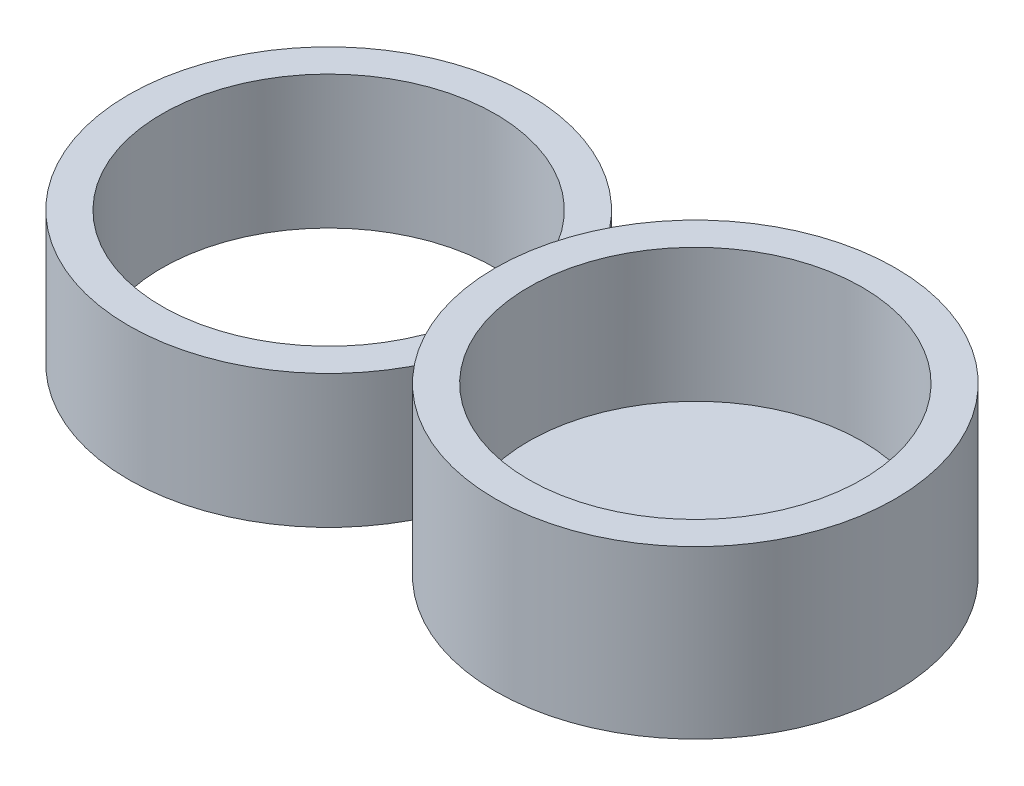
ISO-10303-21;
HEADER;
FILE_DESCRIPTION(('STEP AP214'),'2;1');
FILE_NAME('part.step','',(''),(''),'','','');
FILE_SCHEMA(('AUTOMOTIVE_DESIGN { 1 0 10303 214 1 1 1 1 }'));
ENDSEC;
DATA;
#1=APPLICATION_CONTEXT('core data for automotive mechanical design processes');
#2=APPLICATION_PROTOCOL_DEFINITION('international standard','automotive_design',2000,#1);
#3=PRODUCT_CONTEXT('',#1,'mechanical');
#4=PRODUCT('Part','Part','',(#3));
#5=PRODUCT_RELATED_PRODUCT_CATEGORY('part','',(#4));
#6=PRODUCT_DEFINITION_FORMATION('','',#4);
#7=PRODUCT_DEFINITION_CONTEXT('part definition',#1,'design');
#8=PRODUCT_DEFINITION('design','',#6,#7);
#9=PRODUCT_DEFINITION_SHAPE('','',#8);
#10=(LENGTH_UNIT() NAMED_UNIT(*) SI_UNIT(.MILLI.,.METRE.));
#11=(NAMED_UNIT(*) PLANE_ANGLE_UNIT() SI_UNIT($,.RADIAN.));
#12=(NAMED_UNIT(*) SI_UNIT($,.STERADIAN.) SOLID_ANGLE_UNIT());
#13=UNCERTAINTY_MEASURE_WITH_UNIT(LENGTH_MEASURE(1.E-05),#10,'distance_accuracy_value','');
#14=(GEOMETRIC_REPRESENTATION_CONTEXT(3) GLOBAL_UNCERTAINTY_ASSIGNED_CONTEXT((#13)) GLOBAL_UNIT_ASSIGNED_CONTEXT((#10,
#11,#12)) REPRESENTATION_CONTEXT('',''));
#15=CARTESIAN_POINT('',(0.,0.,0.));
#16=DIRECTION('',(0.,0.,1.));
#17=DIRECTION('',(1.,0.,0.));
#18=AXIS2_PLACEMENT_3D('',#15,#16,#17);
#19=CARTESIAN_POINT('',(0.,4.,0.));
#20=DIRECTION('',(0.,-1.,0.));
#21=DIRECTION('',(0.,0.,-1.));
#22=AXIS2_PLACEMENT_3D('',#19,#20,#21);
#23=CYLINDRICAL_SURFACE('',#22,5.);
#24=CARTESIAN_POINT('',(0.,1.,0.));
#25=DIRECTION('',(0.,-1.,0.));
#26=DIRECTION('',(0.,0.,-1.));
#27=AXIS2_PLACEMENT_3D('',#24,#25,#26);
#28=CIRCLE('',#27,5.);
#29=CARTESIAN_POINT('',(0.,1.,-5.));
#30=VERTEX_POINT('',#29);
#31=EDGE_CURVE('E92',#30,#30,#28,.T.);
#32=ORIENTED_EDGE('',*,*,#31,.T.);
#33=EDGE_LOOP('',(#32));
#34=FACE_BOUND('',#33,.T.);
#35=CARTESIAN_POINT('',(0.,5.,0.));
#36=DIRECTION('',(0.,1.,0.));
#37=DIRECTION('',(0.,0.,1.));
#38=AXIS2_PLACEMENT_3D('',#35,#36,#37);
#39=CIRCLE('',#38,5.);
#40=CARTESIAN_POINT('',(0.,5.,5.));
#41=VERTEX_POINT('',#40);
#42=EDGE_CURVE('E88',#41,#41,#39,.T.);
#43=ORIENTED_EDGE('',*,*,#42,.T.);
#44=EDGE_LOOP('',(#43));
#45=FACE_BOUND('',#44,.T.);
#46=ADVANCED_FACE('F39',(#34,#45),#23,.F.);
#47=CARTESIAN_POINT('',(0.,1.,0.));
#48=DIRECTION('',(0.,-1.,0.));
#49=DIRECTION('',(0.,0.,-1.));
#50=AXIS2_PLACEMENT_3D('',#47,#48,#49);
#51=PLANE('',#50);
#52=ORIENTED_EDGE('',*,*,#31,.F.);
#53=EDGE_LOOP('',(#52));
#54=FACE_BOUND('',#53,.T.);
#55=ADVANCED_FACE('F122',(#54),#51,.F.);
#56=CARTESIAN_POINT('',(0.,5.,0.));
#57=DIRECTION('',(0.,1.,0.));
#58=DIRECTION('',(0.,0.,1.));
#59=AXIS2_PLACEMENT_3D('',#56,#57,#58);
#60=PLANE('',#59);
#61=CARTESIAN_POINT('',(0.,5.,0.));
#62=DIRECTION('',(0.,1.,0.));
#63=DIRECTION('',(0.,0.,1.));
#64=AXIS2_PLACEMENT_3D('',#61,#62,#63);
#65=CIRCLE('',#64,6.);
#66=CARTESIAN_POINT('',(0.,5.,6.));
#67=VERTEX_POINT('',#66);
#68=EDGE_CURVE('E87',#67,#67,#65,.T.);
#69=ORIENTED_EDGE('',*,*,#68,.T.);
#70=EDGE_LOOP('',(#69));
#71=FACE_BOUND('',#70,.T.);
#72=ORIENTED_EDGE('',*,*,#42,.F.);
#73=EDGE_LOOP('',(#72));
#74=FACE_BOUND('',#73,.T.);
#75=ADVANCED_FACE('F128',(#71,#74),#60,.T.);
#76=CARTESIAN_POINT('',(-11.,4.,0.));
#77=DIRECTION('',(0.,-1.,0.));
#78=DIRECTION('',(0.,0.,-1.));
#79=AXIS2_PLACEMENT_3D('',#76,#77,#78);
#80=CYLINDRICAL_SURFACE('',#79,5.);
#81=CARTESIAN_POINT('',(-11.,0.,0.));
#82=DIRECTION('',(0.,1.,0.));
#83=DIRECTION('',(0.,0.,1.));
#84=AXIS2_PLACEMENT_3D('',#81,#82,#83);
#85=CIRCLE('',#84,5.);
#86=CARTESIAN_POINT('',(-11.,0.,5.));
#87=VERTEX_POINT('',#86);
#88=EDGE_CURVE('E100',#87,#87,#85,.T.);
#89=ORIENTED_EDGE('',*,*,#88,.F.);
#90=EDGE_LOOP('',(#89));
#91=FACE_BOUND('',#90,.T.);
#92=CARTESIAN_POINT('',(-11.,4.,0.));
#93=DIRECTION('',(0.,1.,0.));
#94=DIRECTION('',(0.,0.,1.));
#95=AXIS2_PLACEMENT_3D('',#92,#93,#94);
#96=CIRCLE('',#95,5.);
#97=CARTESIAN_POINT('',(-6.,4.,0.));
#98=VERTEX_POINT('',#97);
#99=EDGE_CURVE('E85',#98,#98,#96,.T.);
#100=ORIENTED_EDGE('',*,*,#99,.T.);
#101=EDGE_LOOP('',(#100));
#102=FACE_BOUND('',#101,.T.);
#103=ADVANCED_FACE('F133',(#91,#102),#80,.F.);
#104=CARTESIAN_POINT('',(-5.5,4.,0.));
#105=DIRECTION('',(0.,1.,0.));
#106=DIRECTION('',(0.,0.,1.));
#107=AXIS2_PLACEMENT_3D('',#104,#105,#106);
#108=PLANE('',#107);
#109=CARTESIAN_POINT('',(0.,4.,0.));
#110=DIRECTION('',(0.,1.,0.));
#111=DIRECTION('',(0.,0.,1.));
#112=AXIS2_PLACEMENT_3D('',#109,#110,#111);
#113=CIRCLE('',#112,6.);
#114=CARTESIAN_POINT('',(-5.5,4.,-2.39791576165636));
#115=VERTEX_POINT('',#114);
#116=EDGE_CURVE('E50',#115,#98,#113,.T.);
#117=ORIENTED_EDGE('',*,*,#116,.F.);
#118=CARTESIAN_POINT('',(-11.,4.,0.));
#119=DIRECTION('',(0.,1.,0.));
#120=DIRECTION('',(0.,0.,1.));
#121=AXIS2_PLACEMENT_3D('',#118,#119,#120);
#122=CIRCLE('',#121,6.);
#123=CARTESIAN_POINT('',(-5.5,4.,2.39791576165637));
#124=VERTEX_POINT('',#123);
#125=EDGE_CURVE('E61',#115,#124,#122,.T.);
#126=ORIENTED_EDGE('',*,*,#125,.T.);
#127=EDGE_CURVE('E11',#98,#124,#113,.T.);
#128=ORIENTED_EDGE('',*,*,#127,.F.);
#129=ORIENTED_EDGE('',*,*,#99,.F.);
#130=EDGE_LOOP('',(#117,#126,#128,#129));
#131=FACE_BOUND('',#130,.T.);
#132=ADVANCED_FACE('F84',(#131),#108,.T.);
#133=CARTESIAN_POINT('',(-11.,4.,0.));
#134=DIRECTION('',(0.,-1.,0.));
#135=DIRECTION('',(0.,0.,-1.));
#136=AXIS2_PLACEMENT_3D('',#133,#134,#135);
#137=CYLINDRICAL_SURFACE('',#136,6.);
#138=CARTESIAN_POINT('',(-11.,0.,0.));
#139=DIRECTION('',(0.,1.,0.));
#140=DIRECTION('',(0.,0.,1.));
#141=AXIS2_PLACEMENT_3D('',#138,#139,#140);
#142=CIRCLE('',#141,6.);
#143=CARTESIAN_POINT('',(-5.5,0.,-2.39791576165636));
#144=VERTEX_POINT('',#143);
#145=CARTESIAN_POINT('',(-5.5,0.,2.39791576165637));
#146=VERTEX_POINT('',#145);
#147=EDGE_CURVE('E103',#144,#146,#142,.T.);
#148=ORIENTED_EDGE('',*,*,#147,.T.);
#149=DIRECTION('',(0.,-1.,0.));
#150=VECTOR('',#149,1.);
#151=CARTESIAN_POINT('',(-5.5,4.,2.39791576165637));
#152=LINE('',#151,#150);
#153=EDGE_CURVE('E43',#124,#146,#152,.T.);
#154=ORIENTED_EDGE('',*,*,#153,.F.);
#155=ORIENTED_EDGE('',*,*,#125,.F.);
#156=DIRECTION('',(0.,-1.,0.));
#157=VECTOR('',#156,1.);
#158=CARTESIAN_POINT('',(-5.5,4.,-2.39791576165636));
#159=LINE('',#158,#157);
#160=EDGE_CURVE('E75',#115,#144,#159,.T.);
#161=ORIENTED_EDGE('',*,*,#160,.T.);
#162=EDGE_LOOP('',(#148,#154,#155,#161));
#163=FACE_BOUND('',#162,.T.);
#164=ADVANCED_FACE('F41',(#163),#137,.T.);
#165=CARTESIAN_POINT('',(-5.5,0.,0.));
#166=DIRECTION('',(0.,1.,0.));
#167=DIRECTION('',(0.,0.,1.));
#168=AXIS2_PLACEMENT_3D('',#165,#166,#167);
#169=PLANE('',#168);
#170=ORIENTED_EDGE('',*,*,#88,.T.);
#171=EDGE_LOOP('',(#170));
#172=FACE_BOUND('',#171,.T.);
#173=ORIENTED_EDGE('',*,*,#147,.F.);
#174=CARTESIAN_POINT('',(0.,0.,0.));
#175=DIRECTION('',(0.,1.,0.));
#176=DIRECTION('',(0.,0.,1.));
#177=AXIS2_PLACEMENT_3D('',#174,#175,#176);
#178=CIRCLE('',#177,6.);
#179=EDGE_CURVE('E77',#146,#144,#178,.T.);
#180=ORIENTED_EDGE('',*,*,#179,.F.);
#181=EDGE_LOOP('',(#173,#180));
#182=FACE_BOUND('',#181,.T.);
#183=ADVANCED_FACE('F112',(#172,#182),#169,.F.);
#184=CARTESIAN_POINT('',(0.,4.,0.));
#185=DIRECTION('',(0.,-1.,0.));
#186=DIRECTION('',(0.,0.,-1.));
#187=AXIS2_PLACEMENT_3D('',#184,#185,#186);
#188=CYLINDRICAL_SURFACE('',#187,6.);
#189=ORIENTED_EDGE('',*,*,#179,.T.);
#190=ORIENTED_EDGE('',*,*,#160,.F.);
#191=ORIENTED_EDGE('',*,*,#116,.T.);
#192=ORIENTED_EDGE('',*,*,#127,.T.);
#193=ORIENTED_EDGE('',*,*,#153,.T.);
#194=EDGE_LOOP('',(#189,#190,#191,#192,#193));
#195=FACE_BOUND('',#194,.T.);
#196=ORIENTED_EDGE('',*,*,#68,.F.);
#197=EDGE_LOOP('',(#196));
#198=FACE_BOUND('',#197,.T.);
#199=ADVANCED_FACE('F80',(#195,#198),#188,.T.);
#200=CLOSED_SHELL('',(#46,#55,#75,#103,#132,#164,#183,#199));
#201=MANIFOLD_SOLID_BREP('B2',#200);
#202=ADVANCED_BREP_SHAPE_REPRESENTATION('',(#18,#201),#14);
#203=SHAPE_DEFINITION_REPRESENTATION(#9,#202);
ENDSEC;
END-ISO-10303-21;
